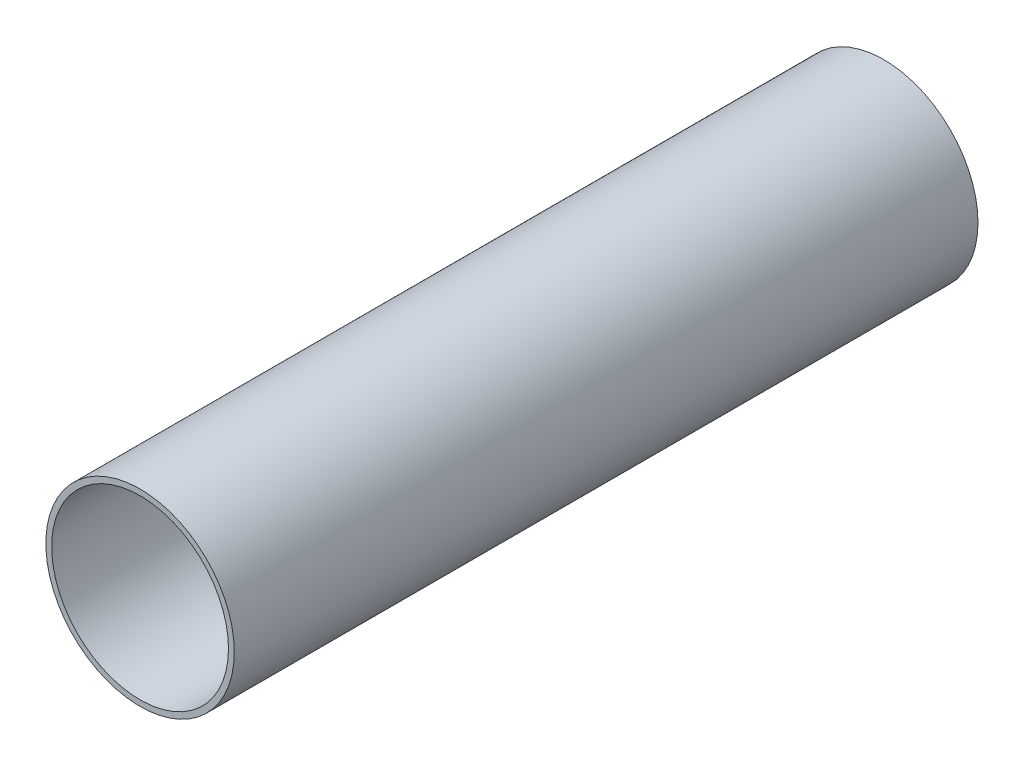
ISO-10303-21;
HEADER;
FILE_DESCRIPTION(('STEP AP214'),'2;1');
FILE_NAME('part.step','',(''),(''),'','','');
FILE_SCHEMA(('AUTOMOTIVE_DESIGN { 1 0 10303 214 1 1 1 1 }'));
ENDSEC;
DATA;
#1=APPLICATION_CONTEXT('core data for automotive mechanical design processes');
#2=APPLICATION_PROTOCOL_DEFINITION('international standard','automotive_design',2000,#1);
#3=PRODUCT_CONTEXT('',#1,'mechanical');
#4=PRODUCT('Part','Part','',(#3));
#5=PRODUCT_RELATED_PRODUCT_CATEGORY('part','',(#4));
#6=PRODUCT_DEFINITION_FORMATION('','',#4);
#7=PRODUCT_DEFINITION_CONTEXT('part definition',#1,'design');
#8=PRODUCT_DEFINITION('design','',#6,#7);
#9=PRODUCT_DEFINITION_SHAPE('','',#8);
#10=(LENGTH_UNIT() NAMED_UNIT(*) SI_UNIT(.MILLI.,.METRE.));
#11=(NAMED_UNIT(*) PLANE_ANGLE_UNIT() SI_UNIT($,.RADIAN.));
#12=(NAMED_UNIT(*) SI_UNIT($,.STERADIAN.) SOLID_ANGLE_UNIT());
#13=UNCERTAINTY_MEASURE_WITH_UNIT(LENGTH_MEASURE(1.E-05),#10,'distance_accuracy_value','');
#14=(GEOMETRIC_REPRESENTATION_CONTEXT(3) GLOBAL_UNCERTAINTY_ASSIGNED_CONTEXT((#13)) GLOBAL_UNIT_ASSIGNED_CONTEXT((#10,
#11,#12)) REPRESENTATION_CONTEXT('',''));
#15=CARTESIAN_POINT('',(0.,0.,0.));
#16=DIRECTION('',(0.,0.,1.));
#17=DIRECTION('',(1.,0.,0.));
#18=AXIS2_PLACEMENT_3D('',#15,#16,#17);
#19=CARTESIAN_POINT('',(0.,0.,273.685));
#20=DIRECTION('',(0.,0.,1.));
#21=DIRECTION('',(1.,0.,0.));
#22=AXIS2_PLACEMENT_3D('',#19,#20,#21);
#23=PLANE('',#22);
#24=CARTESIAN_POINT('',(0.,0.,273.685));
#25=DIRECTION('',(0.,0.,1.));
#26=DIRECTION('',(1.,0.,0.));
#27=AXIS2_PLACEMENT_3D('',#24,#25,#26);
#28=CIRCLE('',#27,34.671);
#29=CARTESIAN_POINT('',(34.671,0.,273.685));
#30=VERTEX_POINT('',#29);
#31=EDGE_CURVE('E10',#30,#30,#28,.T.);
#32=ORIENTED_EDGE('',*,*,#31,.T.);
#33=EDGE_LOOP('',(#32));
#34=FACE_BOUND('',#33,.T.);
#35=CARTESIAN_POINT('',(0.,0.,273.685));
#36=DIRECTION('',(0.,0.,1.));
#37=DIRECTION('',(1.,0.,0.));
#38=AXIS2_PLACEMENT_3D('',#35,#36,#37);
#39=CIRCLE('',#38,32.5374);
#40=CARTESIAN_POINT('',(32.5374,0.,273.685));
#41=VERTEX_POINT('',#40);
#42=EDGE_CURVE('E44',#41,#41,#39,.T.);
#43=ORIENTED_EDGE('',*,*,#42,.F.);
#44=EDGE_LOOP('',(#43));
#45=FACE_BOUND('',#44,.T.);
#46=ADVANCED_FACE('F33',(#34,#45),#23,.T.);
#47=CARTESIAN_POINT('',(0.,0.,0.));
#48=DIRECTION('',(0.,0.,1.));
#49=DIRECTION('',(1.,0.,0.));
#50=AXIS2_PLACEMENT_3D('',#47,#48,#49);
#51=PLANE('',#50);
#52=CARTESIAN_POINT('',(0.,0.,0.));
#53=DIRECTION('',(0.,0.,1.));
#54=DIRECTION('',(1.,0.,0.));
#55=AXIS2_PLACEMENT_3D('',#52,#53,#54);
#56=CIRCLE('',#55,34.671);
#57=CARTESIAN_POINT('',(34.671,0.,0.));
#58=VERTEX_POINT('',#57);
#59=EDGE_CURVE('E37',#58,#58,#56,.T.);
#60=ORIENTED_EDGE('',*,*,#59,.F.);
#61=EDGE_LOOP('',(#60));
#62=FACE_BOUND('',#61,.T.);
#63=CARTESIAN_POINT('',(0.,0.,0.));
#64=DIRECTION('',(0.,0.,1.));
#65=DIRECTION('',(1.,0.,0.));
#66=AXIS2_PLACEMENT_3D('',#63,#64,#65);
#67=CIRCLE('',#66,32.5374);
#68=CARTESIAN_POINT('',(32.5374,0.,0.));
#69=VERTEX_POINT('',#68);
#70=EDGE_CURVE('E46',#69,#69,#67,.T.);
#71=ORIENTED_EDGE('',*,*,#70,.T.);
#72=EDGE_LOOP('',(#71));
#73=FACE_BOUND('',#72,.T.);
#74=ADVANCED_FACE('F56',(#62,#73),#51,.F.);
#75=CARTESIAN_POINT('',(0.,0.,273.685));
#76=DIRECTION('',(0.,0.,-1.));
#77=DIRECTION('',(-1.,0.,0.));
#78=AXIS2_PLACEMENT_3D('',#75,#76,#77);
#79=CYLINDRICAL_SURFACE('',#78,34.671);
#80=ORIENTED_EDGE('',*,*,#31,.F.);
#81=EDGE_LOOP('',(#80));
#82=FACE_BOUND('',#81,.T.);
#83=ORIENTED_EDGE('',*,*,#59,.T.);
#84=EDGE_LOOP('',(#83));
#85=FACE_BOUND('',#84,.T.);
#86=ADVANCED_FACE('F35',(#82,#85),#79,.T.);
#87=CARTESIAN_POINT('',(0.,0.,273.685));
#88=DIRECTION('',(0.,0.,-1.));
#89=DIRECTION('',(-1.,0.,0.));
#90=AXIS2_PLACEMENT_3D('',#87,#88,#89);
#91=CYLINDRICAL_SURFACE('',#90,32.5374);
#92=ORIENTED_EDGE('',*,*,#42,.T.);
#93=EDGE_LOOP('',(#92));
#94=FACE_BOUND('',#93,.T.);
#95=ORIENTED_EDGE('',*,*,#70,.F.);
#96=EDGE_LOOP('',(#95));
#97=FACE_BOUND('',#96,.T.);
#98=ADVANCED_FACE('F52',(#94,#97),#91,.F.);
#99=CLOSED_SHELL('',(#46,#74,#86,#98));
#100=MANIFOLD_SOLID_BREP('B2',#99);
#101=ADVANCED_BREP_SHAPE_REPRESENTATION('',(#18,#100),#14);
#102=SHAPE_DEFINITION_REPRESENTATION(#9,#101);
ENDSEC;
END-ISO-10303-21;
